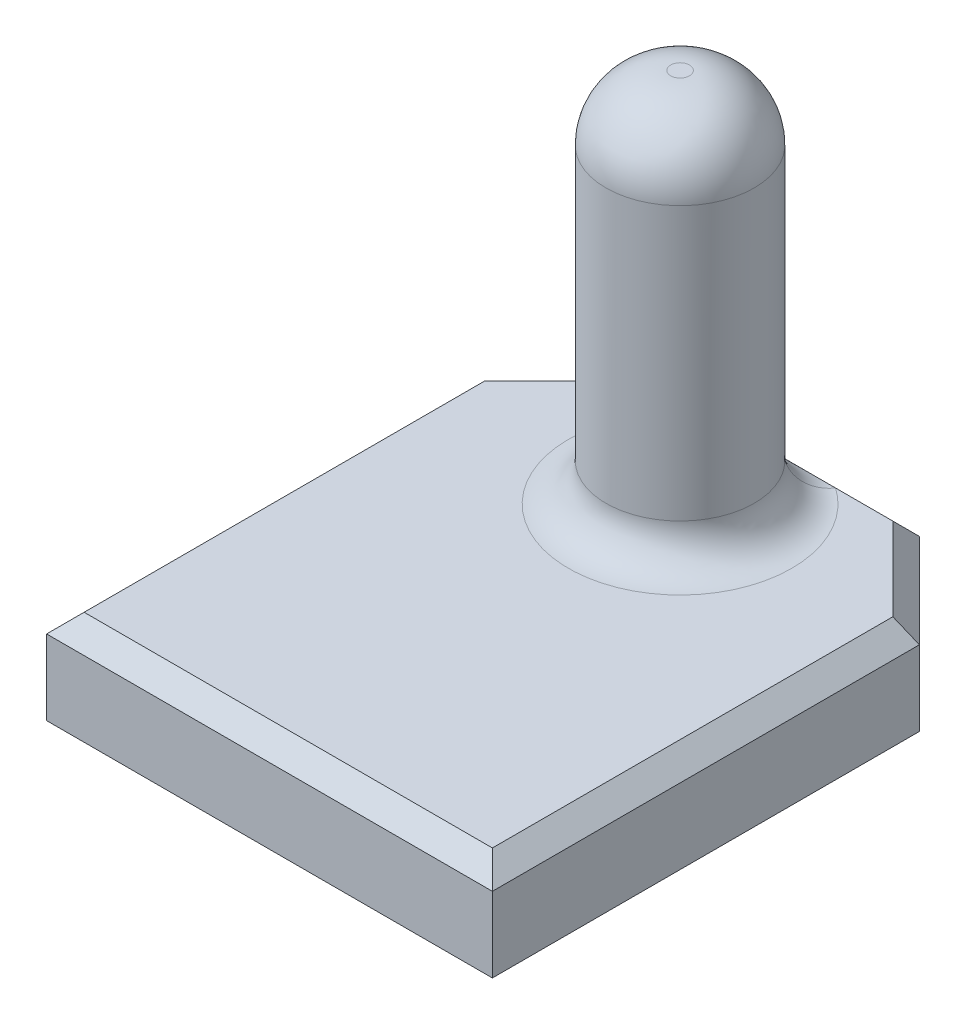
ISO-10303-21;
HEADER;
FILE_DESCRIPTION(('STEP AP214'),'2;1');
FILE_NAME('part.step','',(''),(''),'','','');
FILE_SCHEMA(('AUTOMOTIVE_DESIGN { 1 0 10303 214 1 1 1 1 }'));
ENDSEC;
DATA;
#1=APPLICATION_CONTEXT('core data for automotive mechanical design processes');
#2=APPLICATION_PROTOCOL_DEFINITION('international standard','automotive_design',2000,#1);
#3=PRODUCT_CONTEXT('',#1,'mechanical');
#4=PRODUCT('Part','Part','',(#3));
#5=PRODUCT_RELATED_PRODUCT_CATEGORY('part','',(#4));
#6=PRODUCT_DEFINITION_FORMATION('','',#4);
#7=PRODUCT_DEFINITION_CONTEXT('part definition',#1,'design');
#8=PRODUCT_DEFINITION('design','',#6,#7);
#9=PRODUCT_DEFINITION_SHAPE('','',#8);
#10=(LENGTH_UNIT() NAMED_UNIT(*) SI_UNIT(.MILLI.,.METRE.));
#11=(NAMED_UNIT(*) PLANE_ANGLE_UNIT() SI_UNIT($,.RADIAN.));
#12=(NAMED_UNIT(*) SI_UNIT($,.STERADIAN.) SOLID_ANGLE_UNIT());
#13=UNCERTAINTY_MEASURE_WITH_UNIT(LENGTH_MEASURE(1.E-05),#10,'distance_accuracy_value','');
#14=(GEOMETRIC_REPRESENTATION_CONTEXT(3) GLOBAL_UNCERTAINTY_ASSIGNED_CONTEXT((#13)) GLOBAL_UNIT_ASSIGNED_CONTEXT((#10,
#11,#12)) REPRESENTATION_CONTEXT('',''));
#15=CARTESIAN_POINT('',(0.,0.,0.));
#16=DIRECTION('',(0.,0.,1.));
#17=DIRECTION('',(1.,0.,0.));
#18=AXIS2_PLACEMENT_3D('',#15,#16,#17);
#19=CARTESIAN_POINT('',(-11.875,5.,13.875));
#20=DIRECTION('',(1.,0.,0.));
#21=DIRECTION('',(0.,0.,-1.));
#22=AXIS2_PLACEMENT_3D('',#19,#20,#21);
#23=PLANE('',#22);
#24=DIRECTION('',(0.,-1.,0.));
#25=VECTOR('',#24,1.);
#26=CARTESIAN_POINT('',(-11.875,5.,13.875));
#27=LINE('',#26,#25);
#28=CARTESIAN_POINT('',(-11.875,3.99999999999999,13.875));
#29=VERTEX_POINT('',#28);
#30=CARTESIAN_POINT('',(-11.875,0.,13.875));
#31=VERTEX_POINT('',#30);
#32=EDGE_CURVE('E133',#29,#31,#27,.T.);
#33=ORIENTED_EDGE('',*,*,#32,.F.);
#34=DIRECTION('',(0.,0.,-1.));
#35=VECTOR('',#34,1.);
#36=CARTESIAN_POINT('',(-11.875,3.99999999999999,13.875));
#37=LINE('',#36,#35);
#38=CARTESIAN_POINT('',(-11.875,3.99999999999999,-8.875));
#39=VERTEX_POINT('',#38);
#40=EDGE_CURVE('E207',#29,#39,#37,.T.);
#41=ORIENTED_EDGE('',*,*,#40,.T.);
#42=DIRECTION('',(0.,-1.,0.));
#43=VECTOR('',#42,1.);
#44=CARTESIAN_POINT('',(-11.875,5.,-8.875));
#45=LINE('',#44,#43);
#46=CARTESIAN_POINT('',(-11.875,0.,-8.875));
#47=VERTEX_POINT('',#46);
#48=EDGE_CURVE('E159',#39,#47,#45,.T.);
#49=ORIENTED_EDGE('',*,*,#48,.T.);
#50=DIRECTION('',(0.,0.,1.));
#51=VECTOR('',#50,1.);
#52=CARTESIAN_POINT('',(-11.875,0.,13.875));
#53=LINE('',#52,#51);
#54=EDGE_CURVE('E152',#47,#31,#53,.T.);
#55=ORIENTED_EDGE('',*,*,#54,.T.);
#56=EDGE_LOOP('',(#33,#41,#49,#55));
#57=FACE_BOUND('',#56,.T.);
#58=ADVANCED_FACE('F43',(#57),#23,.F.);
#59=CARTESIAN_POINT('',(-11.875,5.,13.875));
#60=DIRECTION('',(0.,0.,-1.));
#61=DIRECTION('',(-1.,0.,0.));
#62=AXIS2_PLACEMENT_3D('',#59,#60,#61);
#63=PLANE('',#62);
#64=DIRECTION('',(0.,-1.,0.));
#65=VECTOR('',#64,1.);
#66=CARTESIAN_POINT('',(11.875,5.,13.875));
#67=LINE('',#66,#65);
#68=CARTESIAN_POINT('',(11.875,3.99999999999999,13.875));
#69=VERTEX_POINT('',#68);
#70=CARTESIAN_POINT('',(11.875,0.,13.875));
#71=VERTEX_POINT('',#70);
#72=EDGE_CURVE('E143',#69,#71,#67,.T.);
#73=ORIENTED_EDGE('',*,*,#72,.F.);
#74=DIRECTION('',(-1.,0.,0.));
#75=VECTOR('',#74,1.);
#76=CARTESIAN_POINT('',(-11.875,3.99999999999999,13.875));
#77=LINE('',#76,#75);
#78=EDGE_CURVE('E138',#69,#29,#77,.T.);
#79=ORIENTED_EDGE('',*,*,#78,.T.);
#80=ORIENTED_EDGE('',*,*,#32,.T.);
#81=DIRECTION('',(1.,0.,0.));
#82=VECTOR('',#81,1.);
#83=CARTESIAN_POINT('',(-11.875,0.,13.875));
#84=LINE('',#83,#82);
#85=EDGE_CURVE('E139',#31,#71,#84,.T.);
#86=ORIENTED_EDGE('',*,*,#85,.T.);
#87=EDGE_LOOP('',(#73,#79,#80,#86));
#88=FACE_BOUND('',#87,.T.);
#89=ADVANCED_FACE('F137',(#88),#63,.F.);
#90=CARTESIAN_POINT('',(11.875,5.,13.875));
#91=DIRECTION('',(-1.,0.,0.));
#92=DIRECTION('',(0.,0.,1.));
#93=AXIS2_PLACEMENT_3D('',#90,#91,#92);
#94=PLANE('',#93);
#95=DIRECTION('',(0.,-1.,0.));
#96=VECTOR('',#95,1.);
#97=CARTESIAN_POINT('',(11.875,5.,-8.875));
#98=LINE('',#97,#96);
#99=CARTESIAN_POINT('',(11.875,3.99999999999999,-8.875));
#100=VERTEX_POINT('',#99);
#101=CARTESIAN_POINT('',(11.875,0.,-8.875));
#102=VERTEX_POINT('',#101);
#103=EDGE_CURVE('E177',#100,#102,#98,.T.);
#104=ORIENTED_EDGE('',*,*,#103,.F.);
#105=DIRECTION('',(0.,0.,1.));
#106=VECTOR('',#105,1.);
#107=CARTESIAN_POINT('',(11.875,3.99999999999999,13.875));
#108=LINE('',#107,#106);
#109=EDGE_CURVE('E205',#100,#69,#108,.T.);
#110=ORIENTED_EDGE('',*,*,#109,.T.);
#111=ORIENTED_EDGE('',*,*,#72,.T.);
#112=DIRECTION('',(0.,0.,-1.));
#113=VECTOR('',#112,1.);
#114=CARTESIAN_POINT('',(11.875,0.,13.875));
#115=LINE('',#114,#113);
#116=EDGE_CURVE('E154',#71,#102,#115,.T.);
#117=ORIENTED_EDGE('',*,*,#116,.T.);
#118=EDGE_LOOP('',(#104,#110,#111,#117));
#119=FACE_BOUND('',#118,.T.);
#120=ADVANCED_FACE('F290',(#119),#94,.F.);
#121=CARTESIAN_POINT('',(11.875,5.,-8.875));
#122=DIRECTION('',(-0.707106781186547,0.,0.707106781186548));
#123=DIRECTION('',(0.707106781186548,0.,0.707106781186547));
#124=AXIS2_PLACEMENT_3D('',#121,#122,#123);
#125=PLANE('',#124);
#126=DIRECTION('',(0.,-1.,0.));
#127=VECTOR('',#126,1.);
#128=CARTESIAN_POINT('',(6.875,5.,-13.875));
#129=LINE('',#128,#127);
#130=CARTESIAN_POINT('',(6.875,3.99999999999999,-13.875));
#131=VERTEX_POINT('',#130);
#132=CARTESIAN_POINT('',(6.875,0.,-13.875));
#133=VERTEX_POINT('',#132);
#134=EDGE_CURVE('E180',#131,#133,#129,.T.);
#135=ORIENTED_EDGE('',*,*,#134,.F.);
#136=DIRECTION('',(0.707106781186548,0.,0.707106781186547));
#137=VECTOR('',#136,1.);
#138=CARTESIAN_POINT('',(11.875,3.99999999999999,-8.875));
#139=LINE('',#138,#137);
#140=EDGE_CURVE('E202',#131,#100,#139,.T.);
#141=ORIENTED_EDGE('',*,*,#140,.T.);
#142=ORIENTED_EDGE('',*,*,#103,.T.);
#143=DIRECTION('',(-0.707106781186548,0.,-0.707106781186547));
#144=VECTOR('',#143,1.);
#145=CARTESIAN_POINT('',(11.875,0.,-8.875));
#146=LINE('',#145,#144);
#147=EDGE_CURVE('E168',#102,#133,#146,.T.);
#148=ORIENTED_EDGE('',*,*,#147,.T.);
#149=EDGE_LOOP('',(#135,#141,#142,#148));
#150=FACE_BOUND('',#149,.T.);
#151=ADVANCED_FACE('F340',(#150),#125,.F.);
#152=CARTESIAN_POINT('',(-6.875,5.,-13.875));
#153=DIRECTION('',(0.,0.,1.));
#154=DIRECTION('',(1.,0.,0.));
#155=AXIS2_PLACEMENT_3D('',#152,#153,#154);
#156=PLANE('',#155);
#157=DIRECTION('',(0.,-1.,0.));
#158=VECTOR('',#157,1.);
#159=CARTESIAN_POINT('',(-6.875,5.,-13.875));
#160=LINE('',#159,#158);
#161=CARTESIAN_POINT('',(-6.875,3.99999999999999,-13.875));
#162=VERTEX_POINT('',#161);
#163=CARTESIAN_POINT('',(-6.875,0.,-13.875));
#164=VERTEX_POINT('',#163);
#165=EDGE_CURVE('E174',#162,#164,#160,.T.);
#166=ORIENTED_EDGE('',*,*,#165,.F.);
#167=DIRECTION('',(1.,0.,0.));
#168=VECTOR('',#167,1.);
#169=CARTESIAN_POINT('',(-6.875,3.99999999999999,-13.875));
#170=LINE('',#169,#168);
#171=EDGE_CURVE('E199',#162,#131,#170,.T.);
#172=ORIENTED_EDGE('',*,*,#171,.T.);
#173=ORIENTED_EDGE('',*,*,#134,.T.);
#174=DIRECTION('',(-1.,0.,0.));
#175=VECTOR('',#174,1.);
#176=CARTESIAN_POINT('',(-6.875,0.,-13.875));
#177=LINE('',#176,#175);
#178=EDGE_CURVE('E169',#133,#164,#177,.T.);
#179=ORIENTED_EDGE('',*,*,#178,.T.);
#180=EDGE_LOOP('',(#166,#172,#173,#179));
#181=FACE_BOUND('',#180,.T.);
#182=ADVANCED_FACE('F335',(#181),#156,.F.);
#183=CARTESIAN_POINT('',(-11.875,5.,-8.875));
#184=DIRECTION('',(0.707106781186548,0.,0.707106781186548));
#185=DIRECTION('',(0.707106781186548,0.,-0.707106781186548));
#186=AXIS2_PLACEMENT_3D('',#183,#184,#185);
#187=PLANE('',#186);
#188=ORIENTED_EDGE('',*,*,#48,.F.);
#189=DIRECTION('',(0.707106781186548,0.,-0.707106781186548));
#190=VECTOR('',#189,1.);
#191=CARTESIAN_POINT('',(-11.875,3.99999999999999,-8.875));
#192=LINE('',#191,#190);
#193=EDGE_CURVE('E197',#39,#162,#192,.T.);
#194=ORIENTED_EDGE('',*,*,#193,.T.);
#195=ORIENTED_EDGE('',*,*,#165,.T.);
#196=DIRECTION('',(-0.707106781186548,0.,0.707106781186548));
#197=VECTOR('',#196,1.);
#198=CARTESIAN_POINT('',(-11.875,0.,-8.875));
#199=LINE('',#198,#197);
#200=EDGE_CURVE('E175',#164,#47,#199,.T.);
#201=ORIENTED_EDGE('',*,*,#200,.T.);
#202=EDGE_LOOP('',(#188,#194,#195,#201));
#203=FACE_BOUND('',#202,.T.);
#204=ADVANCED_FACE('F332',(#203),#187,.F.);
#205=CARTESIAN_POINT('',(0.,5.,0.));
#206=DIRECTION('',(0.,-1.,0.));
#207=DIRECTION('',(0.,0.,-1.));
#208=AXIS2_PLACEMENT_3D('',#205,#206,#207);
#209=PLANE('',#208);
#210=DIRECTION('',(-1.,0.,0.));
#211=VECTOR('',#210,1.);
#212=CARTESIAN_POINT('',(0.,5.,-12.875));
#213=LINE('',#212,#211);
#214=CARTESIAN_POINT('',(6.4607864376269,5.,-12.875));
#215=VERTEX_POINT('',#214);
#216=CARTESIAN_POINT('',(3.41128641424318,5.,-12.875));
#217=VERTEX_POINT('',#216);
#218=EDGE_CURVE('E188',#215,#217,#213,.T.);
#219=ORIENTED_EDGE('',*,*,#218,.T.);
#220=CARTESIAN_POINT('',(0.,5.,-8.));
#221=DIRECTION('',(0.,-1.,0.));
#222=DIRECTION('',(0.,0.,-1.));
#223=AXIS2_PLACEMENT_3D('',#220,#221,#222);
#224=CIRCLE('',#223,5.95);
#225=CARTESIAN_POINT('',(-3.41128641424318,5.,-12.875));
#226=VERTEX_POINT('',#225);
#227=EDGE_CURVE('E11',#217,#226,#224,.T.);
#228=ORIENTED_EDGE('',*,*,#227,.T.);
#229=CARTESIAN_POINT('',(-6.46078643762691,5.,-12.875));
#230=VERTEX_POINT('',#229);
#231=EDGE_CURVE('E186',#226,#230,#213,.T.);
#232=ORIENTED_EDGE('',*,*,#231,.T.);
#233=DIRECTION('',(-0.707106781186548,0.,0.707106781186548));
#234=VECTOR('',#233,1.);
#235=CARTESIAN_POINT('',(-9.66789321881345,5.,-9.66789321881345));
#236=LINE('',#235,#234);
#237=CARTESIAN_POINT('',(-10.875,5.,-8.4607864376269));
#238=VERTEX_POINT('',#237);
#239=EDGE_CURVE('E195',#230,#238,#236,.T.);
#240=ORIENTED_EDGE('',*,*,#239,.T.);
#241=DIRECTION('',(0.,0.,1.));
#242=VECTOR('',#241,1.);
#243=CARTESIAN_POINT('',(-10.875,5.,0.));
#244=LINE('',#243,#242);
#245=CARTESIAN_POINT('',(-10.875,5.,12.875));
#246=VERTEX_POINT('',#245);
#247=EDGE_CURVE('E144',#238,#246,#244,.T.);
#248=ORIENTED_EDGE('',*,*,#247,.T.);
#249=DIRECTION('',(1.,0.,0.));
#250=VECTOR('',#249,1.);
#251=CARTESIAN_POINT('',(0.,5.,12.875));
#252=LINE('',#251,#250);
#253=CARTESIAN_POINT('',(10.875,5.,12.875));
#254=VERTEX_POINT('',#253);
#255=EDGE_CURVE('E182',#246,#254,#252,.T.);
#256=ORIENTED_EDGE('',*,*,#255,.T.);
#257=DIRECTION('',(0.,0.,-1.));
#258=VECTOR('',#257,1.);
#259=CARTESIAN_POINT('',(10.875,5.,0.));
#260=LINE('',#259,#258);
#261=CARTESIAN_POINT('',(10.875,5.,-8.4607864376269));
#262=VERTEX_POINT('',#261);
#263=EDGE_CURVE('E184',#254,#262,#260,.T.);
#264=ORIENTED_EDGE('',*,*,#263,.T.);
#265=DIRECTION('',(-0.707106781186548,0.,-0.707106781186547));
#266=VECTOR('',#265,1.);
#267=CARTESIAN_POINT('',(9.66789321881345,5.,-9.66789321881345));
#268=LINE('',#267,#266);
#269=EDGE_CURVE('E190',#262,#215,#268,.T.);
#270=ORIENTED_EDGE('',*,*,#269,.T.);
#271=EDGE_LOOP('',(#219,#228,#232,#240,#248,#256,#264,#270));
#272=FACE_BOUND('',#271,.T.);
#273=ADVANCED_FACE('F255',(#272),#209,.F.);
#274=CARTESIAN_POINT('',(0.,0.,0.));
#275=DIRECTION('',(0.,-1.,0.));
#276=DIRECTION('',(0.,0.,-1.));
#277=AXIS2_PLACEMENT_3D('',#274,#275,#276);
#278=PLANE('',#277);
#279=ORIENTED_EDGE('',*,*,#54,.F.);
#280=ORIENTED_EDGE('',*,*,#200,.F.);
#281=ORIENTED_EDGE('',*,*,#178,.F.);
#282=ORIENTED_EDGE('',*,*,#147,.F.);
#283=ORIENTED_EDGE('',*,*,#116,.F.);
#284=ORIENTED_EDGE('',*,*,#85,.F.);
#285=EDGE_LOOP('',(#279,#280,#281,#282,#283,#284));
#286=FACE_BOUND('',#285,.T.);
#287=ADVANCED_FACE('F146',(#286),#278,.T.);
#288=CARTESIAN_POINT('',(10.875,5.,0.));
#289=DIRECTION('',(-0.707106781186549,-0.707106781186546,0.));
#290=DIRECTION('',(0.,0.,-1.));
#291=AXIS2_PLACEMENT_3D('',#288,#289,#290);
#292=PLANE('',#291);
#293=DIRECTION('',(-0.577350269189625,0.577350269189627,-0.577350269189625));
#294=VECTOR('',#293,1.);
#295=CARTESIAN_POINT('',(7.25000000000001,8.625,9.25));
#296=LINE('',#295,#294);
#297=EDGE_CURVE('E162',#69,#254,#296,.T.);
#298=ORIENTED_EDGE('',*,*,#297,.F.);
#299=ORIENTED_EDGE('',*,*,#109,.F.);
#300=DIRECTION('',(-0.678598344545846,0.678598344545849,0.281084637714819));
#301=VECTOR('',#300,1.);
#302=CARTESIAN_POINT('',(9.26115939131318,6.61384060868682,-7.79231177000038));
#303=LINE('',#302,#301);
#304=EDGE_CURVE('E156',#262,#100,#303,.F.);
#305=ORIENTED_EDGE('',*,*,#304,.F.);
#306=ORIENTED_EDGE('',*,*,#263,.F.);
#307=EDGE_LOOP('',(#298,#299,#305,#306));
#308=FACE_BOUND('',#307,.T.);
#309=ADVANCED_FACE('F320',(#308),#292,.F.);
#310=CARTESIAN_POINT('',(9.66789321881345,5.,-9.66789321881345));
#311=DIRECTION('',(-0.500000000000001,-0.707106781186546,0.500000000000001));
#312=DIRECTION('',(-0.707106781186548,0.,-0.707106781186547));
#313=AXIS2_PLACEMENT_3D('',#310,#311,#312);
#314=PLANE('',#313);
#315=ORIENTED_EDGE('',*,*,#304,.T.);
#316=ORIENTED_EDGE('',*,*,#140,.F.);
#317=DIRECTION('',(-0.281084637714817,0.678598344545848,0.678598344545847));
#318=VECTOR('',#317,1.);
#319=CARTESIAN_POINT('',(6.10244037338945,5.8651239283051,-12.0098760716949));
#320=LINE('',#319,#318);
#321=EDGE_CURVE('E217',#215,#131,#320,.F.);
#322=ORIENTED_EDGE('',*,*,#321,.F.);
#323=ORIENTED_EDGE('',*,*,#269,.F.);
#324=EDGE_LOOP('',(#315,#316,#322,#323));
#325=FACE_BOUND('',#324,.T.);
#326=ADVANCED_FACE('F324',(#325),#314,.F.);
#327=CARTESIAN_POINT('',(0.,5.,12.875));
#328=DIRECTION('',(0.,-0.707106781186546,-0.707106781186549));
#329=DIRECTION('',(1.,0.,0.));
#330=AXIS2_PLACEMENT_3D('',#327,#328,#329);
#331=PLANE('',#330);
#332=ORIENTED_EDGE('',*,*,#297,.T.);
#333=ORIENTED_EDGE('',*,*,#255,.F.);
#334=DIRECTION('',(0.577350269189625,0.577350269189627,-0.577350269189625));
#335=VECTOR('',#334,1.);
#336=CARTESIAN_POINT('',(-6.58333333333334,9.29166666666667,8.58333333333334));
#337=LINE('',#336,#335);
#338=EDGE_CURVE('E214',#29,#246,#337,.T.);
#339=ORIENTED_EDGE('',*,*,#338,.F.);
#340=ORIENTED_EDGE('',*,*,#78,.F.);
#341=EDGE_LOOP('',(#332,#333,#339,#340));
#342=FACE_BOUND('',#341,.T.);
#343=ADVANCED_FACE('F306',(#342),#331,.F.);
#344=CARTESIAN_POINT('',(0.,5.,-12.875));
#345=DIRECTION('',(0.,-0.707106781186547,0.707106781186548));
#346=DIRECTION('',(-1.,0.,0.));
#347=AXIS2_PLACEMENT_3D('',#344,#345,#346);
#348=PLANE('',#347);
#349=ORIENTED_EDGE('',*,*,#321,.T.);
#350=ORIENTED_EDGE('',*,*,#171,.F.);
#351=DIRECTION('',(0.281084637714819,0.678598344545848,0.678598344545847));
#352=VECTOR('',#351,1.);
#353=CARTESIAN_POINT('',(-5.95032891711892,6.23235346902573,-11.6426465309743));
#354=LINE('',#353,#352);
#355=EDGE_CURVE('E212',#230,#162,#354,.F.);
#356=ORIENTED_EDGE('',*,*,#355,.F.);
#357=ORIENTED_EDGE('',*,*,#231,.F.);
#358=EDGE_CURVE('E194',#217,#226,#213,.T.);
#359=ORIENTED_EDGE('',*,*,#358,.F.);
#360=ORIENTED_EDGE('',*,*,#218,.F.);
#361=EDGE_LOOP('',(#349,#350,#356,#357,#359,#360));
#362=FACE_BOUND('',#361,.T.);
#363=ADVANCED_FACE('F257',(#362),#348,.F.);
#364=CARTESIAN_POINT('',(-10.875,5.,0.));
#365=DIRECTION('',(0.707106781186549,-0.707106781186546,0.));
#366=DIRECTION('',(0.,0.,1.));
#367=AXIS2_PLACEMENT_3D('',#364,#365,#366);
#368=PLANE('',#367);
#369=ORIENTED_EDGE('',*,*,#338,.T.);
#370=ORIENTED_EDGE('',*,*,#247,.F.);
#371=DIRECTION('',(-0.678598344545846,-0.678598344545848,-0.281084637714821));
#372=VECTOR('',#371,1.);
#373=CARTESIAN_POINT('',(-9.26115939131317,6.61384060868683,-7.79231177000036));
#374=LINE('',#373,#372);
#375=EDGE_CURVE('E209',#39,#238,#374,.F.);
#376=ORIENTED_EDGE('',*,*,#375,.F.);
#377=ORIENTED_EDGE('',*,*,#40,.F.);
#378=EDGE_LOOP('',(#369,#370,#376,#377));
#379=FACE_BOUND('',#378,.T.);
#380=ADVANCED_FACE('F298',(#379),#368,.F.);
#381=CARTESIAN_POINT('',(-9.66789321881345,5.,-9.66789321881345));
#382=DIRECTION('',(0.500000000000001,-0.707106781186547,0.500000000000001));
#383=DIRECTION('',(-0.707106781186548,0.,0.707106781186548));
#384=AXIS2_PLACEMENT_3D('',#381,#382,#383);
#385=PLANE('',#384);
#386=ORIENTED_EDGE('',*,*,#355,.T.);
#387=ORIENTED_EDGE('',*,*,#193,.F.);
#388=ORIENTED_EDGE('',*,*,#375,.T.);
#389=ORIENTED_EDGE('',*,*,#239,.F.);
#390=EDGE_LOOP('',(#386,#387,#388,#389));
#391=FACE_BOUND('',#390,.T.);
#392=ADVANCED_FACE('F272',(#391),#385,.F.);
#393=CARTESIAN_POINT('',(0.,25.,-8.));
#394=DIRECTION('',(0.,-1.,0.));
#395=DIRECTION('',(0.,0.,-1.));
#396=AXIS2_PLACEMENT_3D('',#393,#394,#395);
#397=CYLINDRICAL_SURFACE('',#396,3.95);
#398=CARTESIAN_POINT('',(0.,7.,-8.));
#399=DIRECTION('',(0.,-1.,0.));
#400=DIRECTION('',(0.,0.,-1.));
#401=AXIS2_PLACEMENT_3D('',#398,#399,#400);
#402=CIRCLE('',#401,3.95);
#403=CARTESIAN_POINT('',(-2.26463551869925,7.,-11.2363445378151));
#404=VERTEX_POINT('',#403);
#405=CARTESIAN_POINT('',(2.26463551869925,7.,-11.2363445378151));
#406=VERTEX_POINT('',#405);
#407=EDGE_CURVE('E228',#404,#406,#402,.F.);
#408=ORIENTED_EDGE('',*,*,#407,.T.);
#409=CARTESIAN_POINT('',(2.90256658031642,6.8153326499216,-10.6791056804147));
#410=CARTESIAN_POINT('',(2.31774198213217,4.27761826045532,-11.3127097769033));
#411=CARTESIAN_POINT('',(4.37222054503359,5.,-12.875));
#412=CARTESIAN_POINT('',(2.86608256154765,6.84286497539371,-10.7186475145903));
#413=CARTESIAN_POINT('',(2.33442141965298,4.32291771173192,-11.2774580557659));
#414=CARTESIAN_POINT('',(4.31726360537821,5.,-12.875));
#415=CARTESIAN_POINT('',(2.8282609746915,6.86671946011526,-10.7579870290153));
#416=CARTESIAN_POINT('',(2.34769691957872,4.37172677813012,-11.2493831762693));
#417=CARTESIAN_POINT('',(4.26029184796317,5.,-12.875));
#418=CARTESIAN_POINT('',(2.75029636091294,6.9077974457025,-10.835732496195));
#419=CARTESIAN_POINT('',(2.36599281063151,4.4716819923726,-11.2071335555247));
#420=CARTESIAN_POINT('',(4.14285148036937,5.,-12.875));
#421=CARTESIAN_POINT('',(2.7101579687055,6.92503369116209,-10.8741401084487));
#422=CARTESIAN_POINT('',(2.37120313179334,4.52271985734572,-11.1926449387676));
#423=CARTESIAN_POINT('',(4.08238985159672,5.,-12.875));
#424=CARTESIAN_POINT('',(2.58750756515829,6.96770985504234,-10.9865503699398));
#425=CARTESIAN_POINT('',(2.37362454489826,4.67168121991496,-11.1676229597627));
#426=CARTESIAN_POINT('',(3.89763797789199,5.,-12.875));
#427=CARTESIAN_POINT('',(2.5019237924733,6.98470237211896,-11.0586528669314));
#428=CARTESIAN_POINT('',(2.35920645880949,4.76993895098134,-11.1727442701283));
#429=CARTESIAN_POINT('',(3.7687206494207,5.,-12.875));
#430=CARTESIAN_POINT('',(2.34566684145677,6.99970832606958,-11.1792588746542));
#431=CARTESIAN_POINT('',(2.30527277452876,4.92806352470087,-11.207528680179));
#432=CARTESIAN_POINT('',(3.53334625485345,5.,-12.875));
#433=CARTESIAN_POINT('',(2.27627058516587,7.00126687475856,-11.2293039441198));
#434=CARTESIAN_POINT('',(2.27337463181173,4.99135077494181,-11.2303572354623));
#435=CARTESIAN_POINT('',(3.42881265360454,5.,-12.875));
#436=CARTESIAN_POINT('',(2.13443194533477,6.99685471279959,-11.3247561091991));
#437=CARTESIAN_POINT('',(2.19386541438854,5.10608122240672,-11.2856286580581));
#438=CARTESIAN_POINT('',(3.21515698094711,5.,-12.875));
#439=CARTESIAN_POINT('',(2.06198830841382,6.99088087424269,-11.3701612695717));
#440=CARTESIAN_POINT('',(2.14663345428478,5.15795150798774,-11.3178449133644));
#441=CARTESIAN_POINT('',(3.10603302153466,5.,-12.875));
#442=CARTESIAN_POINT('',(1.83995804459819,6.96472716769324,-11.4995009082781));
#443=CARTESIAN_POINT('',(1.98671471920093,5.29451708318269,-11.4198254510466));
#444=CARTESIAN_POINT('',(2.77158237097719,5.,-12.875));
#445=CARTESIAN_POINT('',(1.6864345412939,6.93629072843791,-11.5759724095117));
#446=CARTESIAN_POINT('',(1.85314086658832,5.36537868420186,-11.4971541107604));
#447=CARTESIAN_POINT('',(2.54032544827833,5.,-12.875));
#448=CARTESIAN_POINT('',(1.36143747378091,6.87032363818735,-11.7124155196155));
#449=CARTESIAN_POINT('',(1.54190554211337,5.47298595576354,-11.6456742085636));
#450=CARTESIAN_POINT('',(2.05077290354321,5.,-12.875));
#451=CARTESIAN_POINT('',(1.18944305021305,6.83233043695772,-11.7710323204281));
#452=CARTESIAN_POINT('',(1.36124990393366,5.50973269264699,-11.717725078329));
#453=CARTESIAN_POINT('',(1.79169269588998,5.,-12.875));
#454=CARTESIAN_POINT('',(0.926494605123117,6.78108804767326,-11.8408724527739));
#455=CARTESIAN_POINT('',(1.07157688431924,5.54679704472753,-11.8060863319265));
#456=CARTESIAN_POINT('',(1.3956057975908,5.,-12.875));
#457=CARTESIAN_POINT('',(0.838116792901417,6.76497941532019,-11.861126207038));
#458=CARTESIAN_POINT('',(0.972654490652768,5.5562076389993,-11.8322256409809));
#459=CARTESIAN_POINT('',(1.26247972601687,5.,-12.875));
#460=CARTESIAN_POINT('',(0.659942811406602,6.73634999068532,-11.8955365691124));
#461=CARTESIAN_POINT('',(0.770599648107005,5.57086102737899,-11.8770530522901));
#462=CARTESIAN_POINT('',(0.994091070347443,5.,-12.875));
#463=CARTESIAN_POINT('',(0.57014714224156,6.72382796189775,-11.9096952790791));
#464=CARTESIAN_POINT('',(0.667162872366965,5.57617197400387,-11.8958950566755));
#465=CARTESIAN_POINT('',(0.858829239579306,5.,-12.875));
#466=CARTESIAN_POINT('',(0.370562334973991,6.70170626422002,-11.9341193433094));
#467=CARTESIAN_POINT('',(0.435807850603427,5.58477130288724,-11.9284495696095));
#468=CARTESIAN_POINT('',(0.5581888336947,5.,-12.875));
#469=CARTESIAN_POINT('',(0.26053359144025,6.69327206630822,-11.9429432302558));
#470=CARTESIAN_POINT('',(0.306543868663886,5.5874587786232,-11.9404482110665));
#471=CARTESIAN_POINT('',(0.392449333941475,5.,-12.875));
#472=CARTESIAN_POINT('',(0.0399748563006738,6.6852571882238,-11.9513391736636));
#473=CARTESIAN_POINT('',(0.047308438281129,5.59001289904045,-11.9518017698105));
#474=CARTESIAN_POINT('',(0.0602152898708021,5.,-12.875));
#475=CARTESIAN_POINT('',(-0.0705551493050796,6.68567675687259,-11.9509109701093));
#476=CARTESIAN_POINT('',(-0.0833546008577208,5.58989313986208,-11.9512173754066));
#477=CARTESIAN_POINT('',(-0.106279275535131,5.,-12.875));
#478=CARTESIAN_POINT('',(-0.291206855035185,6.69530286598372,-11.9408016634849));
#479=CARTESIAN_POINT('',(-0.342535822605119,5.58679276293527,-11.937552951839));
#480=CARTESIAN_POINT('',(-0.438653363914129,5.,-12.875));
#481=CARTESIAN_POINT('',(-0.401327523778211,6.70452454222885,-11.9311046220193));
#482=CARTESIAN_POINT('',(-0.471740888806096,5.58379043530344,-11.924377768705));
#483=CARTESIAN_POINT('',(-0.604531333287479,5.,-12.875));
#484=CARTESIAN_POINT('',(-0.61998097676593,6.73014233800121,-11.9026000538079));
#485=CARTESIAN_POINT('',(-0.724870611944532,5.57355576062247,-11.8864516242652));
#486=CARTESIAN_POINT('',(-0.933895395382946,5.,-12.875));
#487=CARTESIAN_POINT('',(-0.728513617664023,6.74653910112369,-11.8837917097747));
#488=CARTESIAN_POINT('',(-0.849421026392633,5.56626054461234,-11.8615023494095));
#489=CARTESIAN_POINT('',(-1.09738127217791,5.,-12.875));
#490=CARTESIAN_POINT('',(-1.02410541942076,6.79791272818671,-11.8197897911045));
#491=CARTESIAN_POINT('',(-1.18295696571332,5.53690901921802,-11.7784476149883));
#492=CARTESIAN_POINT('',(-1.5426398090001,5.,-12.875));
#493=CARTESIAN_POINT('',(-1.20885238141018,6.83759021822305,-11.7653904588331));
#494=CARTESIAN_POINT('',(-1.38419047199341,5.50748678246158,-11.7089546043852));
#495=CARTESIAN_POINT('',(-1.82092953655435,5.,-12.875));
#496=CARTESIAN_POINT('',(-1.56883180555677,6.91306895886875,-11.6301805510592));
#497=CARTESIAN_POINT('',(-1.74606621788764,5.41128737972151,-11.5538054888967));
#498=CARTESIAN_POINT('',(-2.36317702356041,5.,-12.875));
#499=CARTESIAN_POINT('',(-1.74406540118458,6.94887067176531,-11.5493731300388));
#500=CARTESIAN_POINT('',(-1.90773051671968,5.3422069962095,-11.4662948599018));
#501=CARTESIAN_POINT('',(-2.62713649039203,5.,-12.875));
#502=CARTESIAN_POINT('',(-2.0312717738624,6.98900481457899,-11.3903819083118));
#503=CARTESIAN_POINT('',(-2.12921970646668,5.18094745207043,-11.3306367461961));
#504=CARTESIAN_POINT('',(-3.05976381126104,5.,-12.875));
#505=CARTESIAN_POINT('',(-2.14643721167851,6.99955933873372,-11.3186996215553));
#506=CARTESIAN_POINT('',(-2.20557891154803,5.09917212978066,-11.2776728694674));
#507=CARTESIAN_POINT('',(-3.23324086316123,5.,-12.875));
#508=CARTESIAN_POINT('',(-2.36842083391445,7.00041197972116,-11.1640511825327));
#509=CARTESIAN_POINT('',(-2.3190730143285,4.90868219311968,-11.1982478977815));
#510=CARTESIAN_POINT('',(-3.56762125614967,5.,-12.875));
#511=CARTESIAN_POINT('',(-2.47527796383886,6.99081136225947,-11.0811433890789));
#512=CARTESIAN_POINT('',(-2.35471045089658,4.79833894354032,-11.172792469529));
#513=CARTESIAN_POINT('',(-3.72858326198531,5.,-12.875));
#514=CARTESIAN_POINT('',(-2.65209125602481,6.94818323403568,-10.9289551357717));
#515=CARTESIAN_POINT('',(-2.37670587789153,4.59509931390157,-11.1754038688906));
#516=CARTESIAN_POINT('',(-3.99492227173343,5.,-12.875));
#517=CARTESIAN_POINT('',(-2.72444456756215,6.92185514753215,-10.8616941940246));
#518=CARTESIAN_POINT('',(-2.37231721128514,4.5036761480431,-11.1927767364161));
#519=CARTESIAN_POINT('',(-4.10391017139061,5.,-12.875));
#520=CARTESIAN_POINT('',(-2.8276785032849,6.86678693064065,-10.7584674967585));
#521=CARTESIAN_POINT('',(-2.34758713687408,4.3725797169448,-11.2494957718951));
#522=CARTESIAN_POINT('',(-4.25941445431547,5.,-12.875));
#523=CARTESIAN_POINT('',(-2.86136291735159,6.84568879826914,-10.7234875147608));
#524=CARTESIAN_POINT('',(-2.33590696674601,4.32913606423527,-11.2743039070874));
#525=CARTESIAN_POINT('',(-4.31015426791004,5.,-12.875));
#526=CARTESIAN_POINT('',(-2.92664848269465,6.79772610217291,-10.6532144563848));
#527=CARTESIAN_POINT('',(-2.3070202807741,4.24681497840409,-11.3353782962335));
#528=CARTESIAN_POINT('',(-4.40849581570562,5.,-12.875));
#529=CARTESIAN_POINT('',(-2.9582461061385,6.7708520845391,-10.6179209587469));
#530=CARTESIAN_POINT('',(-2.28971083508489,4.20809238429363,-11.3718571843477));
#531=CARTESIAN_POINT('',(-4.45609223582978,5.,-12.875));
#532=CARTESIAN_POINT('',(-2.98866295629717,6.74085801443615,-10.5827105400445));
#533=CARTESIAN_POINT('',(-2.27035483009232,4.1736495077123,-11.4139228864187));
#534=CARTESIAN_POINT('',(-4.50191002277675,5.,-12.875));
#535=(BOUNDED_SURFACE() B_SPLINE_SURFACE(3,2,((#409,#410,#411),(#412,#413,#414),(#415,#416,
#417),(#418,#419,#420),(#421,#422,#423),(#424,#425,#426),(#427,#428,#429),(#430,#431,#432),
(#433,#434,#435),(#436,#437,#438),(#439,#440,#441),(#442,#443,#444),(#445,#446,#447),(#448,#449,
#450),(#451,#452,#453),(#454,#455,#456),(#457,#458,#459),(#460,#461,#462),(#463,#464,#465),
(#466,#467,#468),(#469,#470,#471),(#472,#473,#474),(#475,#476,#477),(#478,#479,#480),(#481,#482,
#483),(#484,#485,#486),(#487,#488,#489),(#490,#491,#492),(#493,#494,#495),(#496,#497,#498),
(#499,#500,#501),(#502,#503,#504),(#505,#506,#507),(#508,#509,#510),(#511,#512,#513),(#514,#515,
#516),(#517,#518,#519),(#520,#521,#522),(#523,#524,#525),(#526,#527,#528),(#529,#530,#531),
(#532,#533,#534)),.UNSPECIFIED.,.F.,.F.,.F.) B_SPLINE_SURFACE_WITH_KNOTS((4,2,2,2,2,2,2,2,2,2,2,
2,2,2,2,2,2,2,2,2,4),(3,3),(0.,0.256513456379804,0.512530443229835,1.01877542531698,
1.40496977907386,1.79132455723026,2.56833150523679,3.39464022843401,3.80690784546218,
4.21903315889807,4.71768231679817,5.21634548847939,5.71586769083695,6.21543470882468,
7.09060828592329,7.96567736053517,8.57792189773363,9.18709769141898,9.63875782508927,
9.86689382825762,10.0954061251607),(0.,1.),
.UNSPECIFIED.) GEOMETRIC_REPRESENTATION_ITEM() RATIONAL_B_SPLINE_SURFACE(((1.,0.598055846646696,
1.),(1.,0.604741109257609,1.),(1.,0.611658399782754,1.),(1.,0.625780202042719,1.),(1.,
0.632984131962622,1.),(1.,0.654637763933784,1.),(1.,0.669287572213918,1.),(1.,0.69466380814234,
1.),(1.,0.70549679057657,1.),(1.,0.726580146789068,1.),(1.,0.736830276683518,1.),(1.,
0.766468142681094,1.),(1.,0.784615701120146,1.),(1.,0.817505453131057,1.),(1.,0.831958510973681,
1.),(1.,0.849322387452403,1.),(1.,0.854387920871957,1.),(1.,0.863022191021898,1.),(1.,
0.866591443802349,1.),(1.,0.872758570543979,1.),(1.,0.874995185598332,1.),(1.,0.877123189007345,
1.),(1.,0.877014511451186,1.),(1.,0.874452612262287,1.),(1.,0.871995352082939,1.),(1.,
0.864802426986746,1.),(1.,0.860066557678057,1.),(1.,0.844046746190345,1.),(1.,0.830516728300102,
1.),(1.,0.797580243617555,1.),(1.,0.778174478711566,1.),(1.,0.741359460252069,1.),(1.,
0.725101123795047,1.),(1.,0.691309350201652,1.),(1.,0.673782712690087,1.),(1.,0.643377766258451,
1.),(1.,0.630469350534945,1.),(1.,0.61176027487369,1.),(1.,0.605603562358804,1.),(1.,
0.593644876983091,1.),(1.,0.587843505989522,1.),(1.,0.582285675224232,1.))) REPRESENTATION_ITEM('') SURFACE());
#536=CARTESIAN_POINT('',(2.90256658031642,6.8153326499216,-10.6791056804147));
#537=CARTESIAN_POINT('',(2.86608256154765,6.84286497539371,-10.7186475145903));
#538=CARTESIAN_POINT('',(2.8282609746915,6.86671946011526,-10.7579870290153));
#539=CARTESIAN_POINT('',(2.75029636091294,6.9077974457025,-10.835732496195));
#540=CARTESIAN_POINT('',(2.7101579687055,6.92503369116209,-10.8741401084487));
#541=CARTESIAN_POINT('',(2.58750756515829,6.96770985504234,-10.9865503699398));
#542=CARTESIAN_POINT('',(2.5019237924733,6.98470237211896,-11.0586528669314));
#543=CARTESIAN_POINT('',(2.34566684145677,6.99970832606958,-11.1792588746542));
#544=CARTESIAN_POINT('',(2.27627058516587,7.00126687475856,-11.2293039441198));
#545=CARTESIAN_POINT('',(2.13443194533477,6.99685471279959,-11.3247561091991));
#546=CARTESIAN_POINT('',(2.06198830841382,6.99088087424269,-11.3701612695717));
#547=CARTESIAN_POINT('',(1.83995804459819,6.96472716769324,-11.4995009082781));
#548=CARTESIAN_POINT('',(1.6864345412939,6.93629072843791,-11.5759724095117));
#549=CARTESIAN_POINT('',(1.36143747378091,6.87032363818735,-11.7124155196155));
#550=CARTESIAN_POINT('',(1.18944305021305,6.83233043695772,-11.7710323204281));
#551=CARTESIAN_POINT('',(0.926494605123117,6.78108804767326,-11.8408724527739));
#552=CARTESIAN_POINT('',(0.838116792901417,6.76497941532019,-11.861126207038));
#553=CARTESIAN_POINT('',(0.659942811406603,6.73634999068532,-11.8955365691124));
#554=CARTESIAN_POINT('',(0.57014714224156,6.72382796189775,-11.9096952790791));
#555=CARTESIAN_POINT('',(0.370562334973991,6.70170626422002,-11.9341193433094));
#556=CARTESIAN_POINT('',(0.26053359144025,6.69327206630822,-11.9429432302558));
#557=CARTESIAN_POINT('',(0.0399748563006739,6.6852571882238,-11.9513391736636));
#558=CARTESIAN_POINT('',(-0.0705551493050796,6.68567675687259,-11.9509109701093));
#559=CARTESIAN_POINT('',(-0.291206855035185,6.69530286598372,-11.9408016634849));
#560=CARTESIAN_POINT('',(-0.401327523778211,6.70452454222885,-11.9311046220193));
#561=CARTESIAN_POINT('',(-0.61998097676593,6.73014233800121,-11.9026000538079));
#562=CARTESIAN_POINT('',(-0.728513617664023,6.74653910112369,-11.8837917097747));
#563=CARTESIAN_POINT('',(-1.02410541942076,6.79791272818671,-11.8197897911045));
#564=CARTESIAN_POINT('',(-1.20885238141018,6.83759021822305,-11.7653904588331));
#565=CARTESIAN_POINT('',(-1.56883180555677,6.91306895886875,-11.6301805510592));
#566=CARTESIAN_POINT('',(-1.74406540118458,6.94887067176532,-11.5493731300388));
#567=CARTESIAN_POINT('',(-2.0312717738624,6.98900481457899,-11.3903819083118));
#568=CARTESIAN_POINT('',(-2.14643721167851,6.99955933873372,-11.3186996215553));
#569=CARTESIAN_POINT('',(-2.36842083391445,7.00041197972115,-11.1640511825327));
#570=CARTESIAN_POINT('',(-2.47527796383885,6.99081136225947,-11.0811433890789));
#571=CARTESIAN_POINT('',(-2.65209125602481,6.94818323403568,-10.9289551357717));
#572=CARTESIAN_POINT('',(-2.72444456756215,6.92185514753215,-10.8616941940246));
#573=CARTESIAN_POINT('',(-2.8276785032849,6.86678693064065,-10.7584674967585));
#574=CARTESIAN_POINT('',(-2.86136291735159,6.84568879826914,-10.7234875147608));
#575=CARTESIAN_POINT('',(-2.92664848269465,6.79772610217291,-10.6532144563848));
#576=CARTESIAN_POINT('',(-2.9582461061385,6.7708520845391,-10.6179209587469));
#577=CARTESIAN_POINT('',(-2.98866295629717,6.74085801443615,-10.5827105400445));
#578=B_SPLINE_CURVE_WITH_KNOTS('',3,(#536,#537,#538,#539,#540,#541,#542,#543,#544,#545,#546,
#547,#548,#549,#550,#551,#552,#553,#554,#555,#556,#557,#558,#559,#560,#561,#562,#563,#564,#565,
#566,#567,#568,#569,#570,#571,#572,#573,#574,#575,#576,#577),.UNSPECIFIED.,.F.,.F.,(4,2,2,2,2,2,
2,2,2,2,2,2,2,2,2,2,2,2,2,2,4),(0.,0.256513456379804,0.512530443229835,1.01877542531698,
1.40496977907386,1.79132455723026,2.56833150523679,3.39464022843401,3.80690784546218,
4.21903315889807,4.71768231679817,5.21634548847939,5.71586769083695,6.21543470882468,
7.09060828592329,7.96567736053517,8.57792189773363,9.18709769141898,9.63875782508927,
9.86689382825762,10.0954061251607),.UNSPECIFIED.);
#579=EDGE_CURVE('E60',#406,#404,#578,.T.);
#580=ORIENTED_EDGE('',*,*,#579,.T.);
#581=EDGE_LOOP('',(#408,#580));
#582=FACE_BOUND('',#581,.T.);
#583=CARTESIAN_POINT('',(0.,21.55,-8.));
#584=DIRECTION('',(0.,1.,0.));
#585=DIRECTION('',(0.,0.,1.));
#586=AXIS2_PLACEMENT_3D('',#583,#584,#585);
#587=CIRCLE('',#586,3.95);
#588=CARTESIAN_POINT('',(0.,21.55,-4.05));
#589=VERTEX_POINT('',#588);
#590=EDGE_CURVE('E225',#589,#589,#587,.F.);
#591=ORIENTED_EDGE('',*,*,#590,.T.);
#592=EDGE_LOOP('',(#591));
#593=FACE_BOUND('',#592,.T.);
#594=ADVANCED_FACE('F236',(#582,#593),#397,.T.);
#595=CARTESIAN_POINT('',(0.,25.,-8.));
#596=DIRECTION('',(0.,1.,0.));
#597=DIRECTION('',(0.,0.,1.));
#598=AXIS2_PLACEMENT_3D('',#595,#596,#597);
#599=PLANE('',#598);
#600=CARTESIAN_POINT('',(0.,25.,-8.));
#601=DIRECTION('',(0.,1.,0.));
#602=DIRECTION('',(0.,0.,1.));
#603=AXIS2_PLACEMENT_3D('',#600,#601,#602);
#604=CIRCLE('',#603,0.5);
#605=CARTESIAN_POINT('',(0.,25.,-7.5));
#606=VERTEX_POINT('',#605);
#607=EDGE_CURVE('E206',#606,#606,#604,.T.);
#608=ORIENTED_EDGE('',*,*,#607,.T.);
#609=EDGE_LOOP('',(#608));
#610=FACE_BOUND('',#609,.T.);
#611=ADVANCED_FACE('F268',(#610),#599,.T.);
#612=CARTESIAN_POINT('',(0.,21.55,-8.));
#613=DIRECTION('',(0.,1.,0.));
#614=DIRECTION('',(0.,0.,1.));
#615=AXIS2_PLACEMENT_3D('',#612,#613,#614);
#616=DEGENERATE_TOROIDAL_SURFACE('',#615,0.5,3.45,.T.);
#617=ORIENTED_EDGE('',*,*,#590,.F.);
#618=EDGE_LOOP('',(#617));
#619=FACE_BOUND('',#618,.T.);
#620=ORIENTED_EDGE('',*,*,#607,.F.);
#621=EDGE_LOOP('',(#620));
#622=FACE_BOUND('',#621,.T.);
#623=ADVANCED_FACE('F243',(#619,#622),#616,.T.);
#624=CARTESIAN_POINT('',(0.,7.,-8.));
#625=DIRECTION('',(0.,-1.,0.));
#626=DIRECTION('',(0.,0.,-1.));
#627=AXIS2_PLACEMENT_3D('',#624,#625,#626);
#628=TOROIDAL_SURFACE('',#627,5.95,2.);
#629=CARTESIAN_POINT('',(-3.41128641424318,7.,-12.875));
#630=DIRECTION('',(-0.819327731092436,0.,0.573325447771962));
#631=DIRECTION('',(0.573325447771962,0.,0.819327731092436));
#632=AXIS2_PLACEMENT_3D('',#629,#630,#631);
#633=CIRCLE('',#632,2.);
#634=EDGE_CURVE('E265',#226,#404,#633,.T.);
#635=ORIENTED_EDGE('',*,*,#634,.F.);
#636=ORIENTED_EDGE('',*,*,#227,.F.);
#637=CARTESIAN_POINT('',(3.41128641424318,7.,-12.875));
#638=DIRECTION('',(0.819327731092436,0.,0.573325447771963));
#639=DIRECTION('',(0.573325447771963,0.,-0.819327731092436));
#640=AXIS2_PLACEMENT_3D('',#637,#638,#639);
#641=CIRCLE('',#640,2.);
#642=EDGE_CURVE('E72',#406,#217,#641,.T.);
#643=ORIENTED_EDGE('',*,*,#642,.F.);
#644=ORIENTED_EDGE('',*,*,#407,.F.);
#645=EDGE_LOOP('',(#635,#636,#643,#644));
#646=FACE_BOUND('',#645,.T.);
#647=ADVANCED_FACE('F44',(#646),#628,.F.);
#648=ORIENTED_EDGE('',*,*,#642,.T.);
#649=ORIENTED_EDGE('',*,*,#358,.T.);
#650=ORIENTED_EDGE('',*,*,#634,.T.);
#651=ORIENTED_EDGE('',*,*,#579,.F.);
#652=EDGE_LOOP('',(#648,#649,#650,#651));
#653=FACE_BOUND('',#652,.T.);
#654=ADVANCED_FACE('F244',(#653),#535,.F.);
#655=CLOSED_SHELL('',(#58,#89,#120,#151,#182,#204,#273,#287,#309,#326,#343,#363,#380,#392,#594,
#611,#623,#647,#654));
#656=MANIFOLD_SOLID_BREP('B2',#655);
#657=ADVANCED_BREP_SHAPE_REPRESENTATION('',(#18,#656),#14);
#658=SHAPE_DEFINITION_REPRESENTATION(#9,#657);
ENDSEC;
END-ISO-10303-21;
